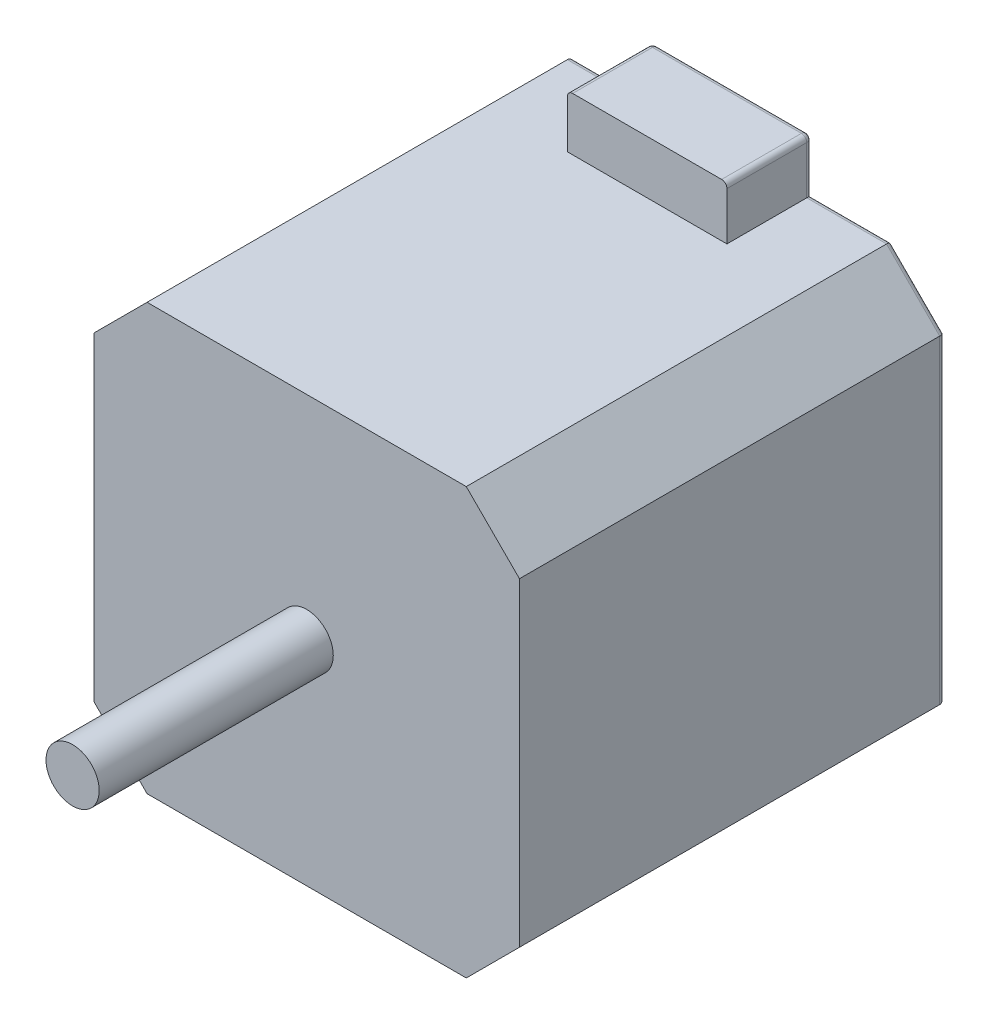
ISO-10303-21;
HEADER;
FILE_DESCRIPTION(('STEP AP214'),'2;1');
FILE_NAME('part.step','',(''),(''),'','','');
FILE_SCHEMA(('AUTOMOTIVE_DESIGN { 1 0 10303 214 1 1 1 1 }'));
ENDSEC;
DATA;
#1=APPLICATION_CONTEXT('core data for automotive mechanical design processes');
#2=APPLICATION_PROTOCOL_DEFINITION('international standard','automotive_design',2000,#1);
#3=PRODUCT_CONTEXT('',#1,'mechanical');
#4=PRODUCT('Part','Part','',(#3));
#5=PRODUCT_RELATED_PRODUCT_CATEGORY('part','',(#4));
#6=PRODUCT_DEFINITION_FORMATION('','',#4);
#7=PRODUCT_DEFINITION_CONTEXT('part definition',#1,'design');
#8=PRODUCT_DEFINITION('design','',#6,#7);
#9=PRODUCT_DEFINITION_SHAPE('','',#8);
#10=(LENGTH_UNIT() NAMED_UNIT(*) SI_UNIT(.MILLI.,.METRE.));
#11=(NAMED_UNIT(*) PLANE_ANGLE_UNIT() SI_UNIT($,.RADIAN.));
#12=(NAMED_UNIT(*) SI_UNIT($,.STERADIAN.) SOLID_ANGLE_UNIT());
#13=UNCERTAINTY_MEASURE_WITH_UNIT(LENGTH_MEASURE(1.E-05),#10,'distance_accuracy_value','');
#14=(GEOMETRIC_REPRESENTATION_CONTEXT(3) GLOBAL_UNCERTAINTY_ASSIGNED_CONTEXT((#13)) GLOBAL_UNIT_ASSIGNED_CONTEXT((#10,
#11,#12)) REPRESENTATION_CONTEXT('',''));
#15=CARTESIAN_POINT('',(0.,0.,0.));
#16=DIRECTION('',(0.,0.,1.));
#17=DIRECTION('',(1.,0.,0.));
#18=AXIS2_PLACEMENT_3D('',#15,#16,#17);
#19=CARTESIAN_POINT('',(20.,20.,40.));
#20=DIRECTION('',(0.,-1.,0.));
#21=DIRECTION('',(1.,0.,0.));
#22=AXIS2_PLACEMENT_3D('',#19,#20,#21);
#23=PLANE('',#22);
#24=DIRECTION('',(0.,0.,-1.));
#25=VECTOR('',#24,1.);
#26=CARTESIAN_POINT('',(15.,20.,40.));
#27=LINE('',#26,#25);
#28=CARTESIAN_POINT('',(15.,20.,40.));
#29=VERTEX_POINT('',#28);
#30=CARTESIAN_POINT('',(15.,20.,0.5));
#31=VERTEX_POINT('',#30);
#32=EDGE_CURVE('E245',#29,#31,#27,.T.);
#33=ORIENTED_EDGE('',*,*,#32,.T.);
#34=DIRECTION('',(-1.,0.,0.));
#35=VECTOR('',#34,1.);
#36=CARTESIAN_POINT('',(20.,20.,0.5));
#37=LINE('',#36,#35);
#38=CARTESIAN_POINT('',(7.5,20.,0.5));
#39=VERTEX_POINT('',#38);
#40=EDGE_CURVE('E285',#31,#39,#37,.T.);
#41=ORIENTED_EDGE('',*,*,#40,.T.);
#42=DIRECTION('',(0.,0.,-1.));
#43=VECTOR('',#42,1.);
#44=CARTESIAN_POINT('',(7.5,20.,8.));
#45=LINE('',#44,#43);
#46=CARTESIAN_POINT('',(7.5,20.,8.));
#47=VERTEX_POINT('',#46);
#48=EDGE_CURVE('E198',#47,#39,#45,.T.);
#49=ORIENTED_EDGE('',*,*,#48,.F.);
#50=DIRECTION('',(1.,0.,0.));
#51=VECTOR('',#50,1.);
#52=CARTESIAN_POINT('',(7.5,20.,8.));
#53=LINE('',#52,#51);
#54=CARTESIAN_POINT('',(-7.5,20.,8.));
#55=VERTEX_POINT('',#54);
#56=EDGE_CURVE('E184',#55,#47,#53,.T.);
#57=ORIENTED_EDGE('',*,*,#56,.F.);
#58=DIRECTION('',(0.,0.,-1.));
#59=VECTOR('',#58,1.);
#60=CARTESIAN_POINT('',(-7.5,20.,8.));
#61=LINE('',#60,#59);
#62=CARTESIAN_POINT('',(-7.5,20.,0.5));
#63=VERTEX_POINT('',#62);
#64=EDGE_CURVE('E191',#55,#63,#61,.T.);
#65=ORIENTED_EDGE('',*,*,#64,.T.);
#66=DIRECTION('',(-1.,0.,0.));
#67=VECTOR('',#66,1.);
#68=CARTESIAN_POINT('',(20.,20.,0.5));
#69=LINE('',#68,#67);
#70=CARTESIAN_POINT('',(-15.,20.,0.5));
#71=VERTEX_POINT('',#70);
#72=EDGE_CURVE('E283',#63,#71,#69,.T.);
#73=ORIENTED_EDGE('',*,*,#72,.T.);
#74=DIRECTION('',(0.,0.,1.));
#75=VECTOR('',#74,1.);
#76=CARTESIAN_POINT('',(-15.,20.,40.));
#77=LINE('',#76,#75);
#78=CARTESIAN_POINT('',(-15.,20.,40.));
#79=VERTEX_POINT('',#78);
#80=EDGE_CURVE('E247',#71,#79,#77,.T.);
#81=ORIENTED_EDGE('',*,*,#80,.T.);
#82=DIRECTION('',(-1.,0.,0.));
#83=VECTOR('',#82,1.);
#84=CARTESIAN_POINT('',(20.,20.,40.));
#85=LINE('',#84,#83);
#86=EDGE_CURVE('E219',#29,#79,#85,.T.);
#87=ORIENTED_EDGE('',*,*,#86,.F.);
#88=EDGE_LOOP('',(#33,#41,#49,#57,#65,#73,#81,#87));
#89=FACE_BOUND('',#88,.T.);
#90=ADVANCED_FACE('F40',(#89),#23,.F.);
#91=CARTESIAN_POINT('',(-20.,-20.,40.));
#92=DIRECTION('',(1.,0.,0.));
#93=DIRECTION('',(0.,0.,-1.));
#94=AXIS2_PLACEMENT_3D('',#91,#92,#93);
#95=PLANE('',#94);
#96=DIRECTION('',(0.,0.,-1.));
#97=VECTOR('',#96,1.);
#98=CARTESIAN_POINT('',(-20.,15.,40.));
#99=LINE('',#98,#97);
#100=CARTESIAN_POINT('',(-20.,15.,40.));
#101=VERTEX_POINT('',#100);
#102=CARTESIAN_POINT('',(-20.,15.,0.5));
#103=VERTEX_POINT('',#102);
#104=EDGE_CURVE('E227',#101,#103,#99,.T.);
#105=ORIENTED_EDGE('',*,*,#104,.T.);
#106=DIRECTION('',(0.,-1.,0.));
#107=VECTOR('',#106,1.);
#108=CARTESIAN_POINT('',(-20.,-20.,0.5));
#109=LINE('',#108,#107);
#110=CARTESIAN_POINT('',(-20.,-15.,0.5));
#111=VERTEX_POINT('',#110);
#112=EDGE_CURVE('E294',#103,#111,#109,.T.);
#113=ORIENTED_EDGE('',*,*,#112,.T.);
#114=DIRECTION('',(0.,0.,1.));
#115=VECTOR('',#114,1.);
#116=CARTESIAN_POINT('',(-20.,-15.,40.));
#117=LINE('',#116,#115);
#118=CARTESIAN_POINT('',(-20.,-15.,40.));
#119=VERTEX_POINT('',#118);
#120=EDGE_CURVE('E230',#111,#119,#117,.T.);
#121=ORIENTED_EDGE('',*,*,#120,.T.);
#122=DIRECTION('',(0.,-1.,0.));
#123=VECTOR('',#122,1.);
#124=CARTESIAN_POINT('',(-20.,-20.,40.));
#125=LINE('',#124,#123);
#126=EDGE_CURVE('E197',#101,#119,#125,.T.);
#127=ORIENTED_EDGE('',*,*,#126,.F.);
#128=EDGE_LOOP('',(#105,#113,#121,#127));
#129=FACE_BOUND('',#128,.T.);
#130=ADVANCED_FACE('F376',(#129),#95,.F.);
#131=CARTESIAN_POINT('',(20.,-20.,40.));
#132=DIRECTION('',(0.,1.,0.));
#133=DIRECTION('',(-1.,0.,0.));
#134=AXIS2_PLACEMENT_3D('',#131,#132,#133);
#135=PLANE('',#134);
#136=DIRECTION('',(0.,0.,-1.));
#137=VECTOR('',#136,1.);
#138=CARTESIAN_POINT('',(-15.,-20.,40.));
#139=LINE('',#138,#137);
#140=CARTESIAN_POINT('',(-15.,-20.,40.));
#141=VERTEX_POINT('',#140);
#142=CARTESIAN_POINT('',(-15.,-20.,0.5));
#143=VERTEX_POINT('',#142);
#144=EDGE_CURVE('E224',#141,#143,#139,.T.);
#145=ORIENTED_EDGE('',*,*,#144,.T.);
#146=DIRECTION('',(1.,0.,0.));
#147=VECTOR('',#146,1.);
#148=CARTESIAN_POINT('',(20.,-20.,0.5));
#149=LINE('',#148,#147);
#150=CARTESIAN_POINT('',(15.,-20.,0.5));
#151=VERTEX_POINT('',#150);
#152=EDGE_CURVE('E298',#143,#151,#149,.T.);
#153=ORIENTED_EDGE('',*,*,#152,.T.);
#154=DIRECTION('',(0.,0.,1.));
#155=VECTOR('',#154,1.);
#156=CARTESIAN_POINT('',(15.,-20.,40.));
#157=LINE('',#156,#155);
#158=CARTESIAN_POINT('',(15.,-20.,40.));
#159=VERTEX_POINT('',#158);
#160=EDGE_CURVE('E222',#151,#159,#157,.T.);
#161=ORIENTED_EDGE('',*,*,#160,.T.);
#162=DIRECTION('',(1.,0.,0.));
#163=VECTOR('',#162,1.);
#164=CARTESIAN_POINT('',(20.,-20.,40.));
#165=LINE('',#164,#163);
#166=EDGE_CURVE('E213',#141,#159,#165,.T.);
#167=ORIENTED_EDGE('',*,*,#166,.F.);
#168=EDGE_LOOP('',(#145,#153,#161,#167));
#169=FACE_BOUND('',#168,.T.);
#170=ADVANCED_FACE('F381',(#169),#135,.F.);
#171=CARTESIAN_POINT('',(20.,-20.,40.));
#172=DIRECTION('',(-1.,0.,0.));
#173=DIRECTION('',(0.,0.,1.));
#174=AXIS2_PLACEMENT_3D('',#171,#172,#173);
#175=PLANE('',#174);
#176=DIRECTION('',(0.,0.,-1.));
#177=VECTOR('',#176,1.);
#178=CARTESIAN_POINT('',(20.,-15.,40.));
#179=LINE('',#178,#177);
#180=CARTESIAN_POINT('',(20.,-15.,40.));
#181=VERTEX_POINT('',#180);
#182=CARTESIAN_POINT('',(20.,-15.,0.5));
#183=VERTEX_POINT('',#182);
#184=EDGE_CURVE('E242',#181,#183,#179,.T.);
#185=ORIENTED_EDGE('',*,*,#184,.T.);
#186=DIRECTION('',(0.,1.,0.));
#187=VECTOR('',#186,1.);
#188=CARTESIAN_POINT('',(20.,-20.,0.5));
#189=LINE('',#188,#187);
#190=CARTESIAN_POINT('',(20.,15.,0.5));
#191=VERTEX_POINT('',#190);
#192=EDGE_CURVE('E279',#183,#191,#189,.T.);
#193=ORIENTED_EDGE('',*,*,#192,.T.);
#194=DIRECTION('',(0.,0.,1.));
#195=VECTOR('',#194,1.);
#196=CARTESIAN_POINT('',(20.,15.,40.));
#197=LINE('',#196,#195);
#198=CARTESIAN_POINT('',(20.,15.,40.));
#199=VERTEX_POINT('',#198);
#200=EDGE_CURVE('E240',#191,#199,#197,.T.);
#201=ORIENTED_EDGE('',*,*,#200,.T.);
#202=DIRECTION('',(0.,1.,0.));
#203=VECTOR('',#202,1.);
#204=CARTESIAN_POINT('',(20.,-20.,40.));
#205=LINE('',#204,#203);
#206=EDGE_CURVE('E216',#181,#199,#205,.T.);
#207=ORIENTED_EDGE('',*,*,#206,.F.);
#208=EDGE_LOOP('',(#185,#193,#201,#207));
#209=FACE_BOUND('',#208,.T.);
#210=ADVANCED_FACE('F388',(#209),#175,.F.);
#211=CARTESIAN_POINT('',(0.,0.,40.));
#212=DIRECTION('',(0.,0.,1.));
#213=DIRECTION('',(1.,0.,0.));
#214=AXIS2_PLACEMENT_3D('',#211,#212,#213);
#215=PLANE('',#214);
#216=CARTESIAN_POINT('',(0.,0.,40.));
#217=DIRECTION('',(0.,0.,1.));
#218=DIRECTION('',(1.,0.,0.));
#219=AXIS2_PLACEMENT_3D('',#216,#217,#218);
#220=CIRCLE('',#219,2.5);
#221=CARTESIAN_POINT('',(2.5,0.,40.));
#222=VERTEX_POINT('',#221);
#223=EDGE_CURVE('E349',#222,#222,#220,.F.);
#224=ORIENTED_EDGE('',*,*,#223,.T.);
#225=EDGE_LOOP('',(#224));
#226=FACE_BOUND('',#225,.T.);
#227=ORIENTED_EDGE('',*,*,#126,.T.);
#228=DIRECTION('',(-0.707106781186547,0.707106781186549,0.));
#229=VECTOR('',#228,1.);
#230=CARTESIAN_POINT('',(-17.5,-17.5,40.));
#231=LINE('',#230,#229);
#232=EDGE_CURVE('E238',#119,#141,#231,.F.);
#233=ORIENTED_EDGE('',*,*,#232,.T.);
#234=ORIENTED_EDGE('',*,*,#166,.T.);
#235=DIRECTION('',(-0.707106781186549,-0.707106781186546,0.));
#236=VECTOR('',#235,1.);
#237=CARTESIAN_POINT('',(17.5,-17.5,40.));
#238=LINE('',#237,#236);
#239=EDGE_CURVE('E236',#159,#181,#238,.F.);
#240=ORIENTED_EDGE('',*,*,#239,.T.);
#241=ORIENTED_EDGE('',*,*,#206,.T.);
#242=DIRECTION('',(0.707106781186546,-0.707106781186549,0.));
#243=VECTOR('',#242,1.);
#244=CARTESIAN_POINT('',(17.5,17.5,40.));
#245=LINE('',#244,#243);
#246=EDGE_CURVE('E232',#199,#29,#245,.F.);
#247=ORIENTED_EDGE('',*,*,#246,.T.);
#248=ORIENTED_EDGE('',*,*,#86,.T.);
#249=DIRECTION('',(0.707106781186549,0.707106781186546,0.));
#250=VECTOR('',#249,1.);
#251=CARTESIAN_POINT('',(-17.5,17.5,40.));
#252=LINE('',#251,#250);
#253=EDGE_CURVE('E234',#79,#101,#252,.F.);
#254=ORIENTED_EDGE('',*,*,#253,.T.);
#255=EDGE_LOOP('',(#227,#233,#234,#240,#241,#247,#248,#254));
#256=FACE_BOUND('',#255,.T.);
#257=ADVANCED_FACE('F391',(#226,#256),#215,.T.);
#258=CARTESIAN_POINT('',(0.,0.,0.));
#259=DIRECTION('',(0.,0.,1.));
#260=DIRECTION('',(1.,0.,0.));
#261=AXIS2_PLACEMENT_3D('',#258,#259,#260);
#262=PLANE('',#261);
#263=DIRECTION('',(0.,1.,0.));
#264=VECTOR('',#263,1.);
#265=CARTESIAN_POINT('',(19.5,0.,0.));
#266=LINE('',#265,#264);
#267=CARTESIAN_POINT('',(19.5,14.7928932188134,0.));
#268=VERTEX_POINT('',#267);
#269=CARTESIAN_POINT('',(19.5,-14.7928932188135,0.));
#270=VERTEX_POINT('',#269);
#271=EDGE_CURVE('E271',#268,#270,#266,.F.);
#272=ORIENTED_EDGE('',*,*,#271,.T.);
#273=DIRECTION('',(0.707106781186549,0.707106781186546,0.));
#274=VECTOR('',#273,1.);
#275=CARTESIAN_POINT('',(14.6464466094067,-19.6464466094067,0.));
#276=LINE('',#275,#274);
#277=CARTESIAN_POINT('',(14.7928932188135,-19.5,0.));
#278=VERTEX_POINT('',#277);
#279=EDGE_CURVE('E273',#270,#278,#276,.F.);
#280=ORIENTED_EDGE('',*,*,#279,.T.);
#281=DIRECTION('',(1.,0.,0.));
#282=VECTOR('',#281,1.);
#283=CARTESIAN_POINT('',(0.,-19.5,0.));
#284=LINE('',#283,#282);
#285=CARTESIAN_POINT('',(-14.7928932188134,-19.5,0.));
#286=VERTEX_POINT('',#285);
#287=EDGE_CURVE('E249',#278,#286,#284,.F.);
#288=ORIENTED_EDGE('',*,*,#287,.T.);
#289=DIRECTION('',(0.707106781186547,-0.707106781186549,0.));
#290=VECTOR('',#289,1.);
#291=CARTESIAN_POINT('',(-19.6464466094067,-14.6464466094067,0.));
#292=LINE('',#291,#290);
#293=CARTESIAN_POINT('',(-19.5,-14.7928932188135,0.));
#294=VERTEX_POINT('',#293);
#295=EDGE_CURVE('E251',#286,#294,#292,.F.);
#296=ORIENTED_EDGE('',*,*,#295,.T.);
#297=DIRECTION('',(0.,-1.,0.));
#298=VECTOR('',#297,1.);
#299=CARTESIAN_POINT('',(-19.5,0.,0.));
#300=LINE('',#299,#298);
#301=CARTESIAN_POINT('',(-19.5,14.7928932188135,0.));
#302=VERTEX_POINT('',#301);
#303=EDGE_CURVE('E253',#294,#302,#300,.F.);
#304=ORIENTED_EDGE('',*,*,#303,.T.);
#305=DIRECTION('',(-0.707106781186549,-0.707106781186546,0.));
#306=VECTOR('',#305,1.);
#307=CARTESIAN_POINT('',(-14.6464466094067,19.6464466094067,0.));
#308=LINE('',#307,#306);
#309=CARTESIAN_POINT('',(-14.7928932188134,19.5,0.));
#310=VERTEX_POINT('',#309);
#311=EDGE_CURVE('E255',#302,#310,#308,.F.);
#312=ORIENTED_EDGE('',*,*,#311,.T.);
#313=DIRECTION('',(-1.,0.,0.));
#314=VECTOR('',#313,1.);
#315=CARTESIAN_POINT('',(0.,19.5,0.));
#316=LINE('',#315,#314);
#317=CARTESIAN_POINT('',(-7.,19.5,0.));
#318=VERTEX_POINT('',#317);
#319=EDGE_CURVE('E257',#310,#318,#316,.F.);
#320=ORIENTED_EDGE('',*,*,#319,.T.);
#321=DIRECTION('',(0.,-1.,0.));
#322=VECTOR('',#321,1.);
#323=CARTESIAN_POINT('',(-6.99999999999999,0.,0.));
#324=LINE('',#323,#322);
#325=CARTESIAN_POINT('',(-7.,24.5,0.));
#326=VERTEX_POINT('',#325);
#327=EDGE_CURVE('E259',#318,#326,#324,.F.);
#328=ORIENTED_EDGE('',*,*,#327,.T.);
#329=DIRECTION('',(-1.,0.,0.));
#330=VECTOR('',#329,1.);
#331=CARTESIAN_POINT('',(0.,24.5,0.));
#332=LINE('',#331,#330);
#333=CARTESIAN_POINT('',(7.,24.5,0.));
#334=VERTEX_POINT('',#333);
#335=EDGE_CURVE('E262',#326,#334,#332,.F.);
#336=ORIENTED_EDGE('',*,*,#335,.T.);
#337=DIRECTION('',(0.,1.,0.));
#338=VECTOR('',#337,1.);
#339=CARTESIAN_POINT('',(7.00000000000001,0.,0.));
#340=LINE('',#339,#338);
#341=CARTESIAN_POINT('',(7.,19.5,0.));
#342=VERTEX_POINT('',#341);
#343=EDGE_CURVE('E265',#334,#342,#340,.F.);
#344=ORIENTED_EDGE('',*,*,#343,.T.);
#345=DIRECTION('',(-1.,0.,0.));
#346=VECTOR('',#345,1.);
#347=CARTESIAN_POINT('',(0.,19.5,0.));
#348=LINE('',#347,#346);
#349=CARTESIAN_POINT('',(14.7928932188135,19.5,0.));
#350=VERTEX_POINT('',#349);
#351=EDGE_CURVE('E267',#342,#350,#348,.F.);
#352=ORIENTED_EDGE('',*,*,#351,.T.);
#353=DIRECTION('',(-0.707106781186546,0.707106781186549,0.));
#354=VECTOR('',#353,1.);
#355=CARTESIAN_POINT('',(19.6464466094067,14.6464466094067,0.));
#356=LINE('',#355,#354);
#357=EDGE_CURVE('E269',#350,#268,#356,.F.);
#358=ORIENTED_EDGE('',*,*,#357,.T.);
#359=EDGE_LOOP('',(#272,#280,#288,#296,#304,#312,#320,#328,#336,#344,#352,#358));
#360=FACE_BOUND('',#359,.T.);
#361=ADVANCED_FACE('F386',(#360),#262,.F.);
#362=CARTESIAN_POINT('',(-15.,-20.,40.));
#363=DIRECTION('',(0.707106781186548,0.707106781186546,0.));
#364=DIRECTION('',(0.,0.,-1.));
#365=AXIS2_PLACEMENT_3D('',#362,#363,#364);
#366=PLANE('',#365);
#367=ORIENTED_EDGE('',*,*,#120,.F.);
#368=DIRECTION('',(-0.707106781186547,0.707106781186549,0.));
#369=VECTOR('',#368,1.);
#370=CARTESIAN_POINT('',(-15.,-20.,0.5));
#371=LINE('',#370,#369);
#372=EDGE_CURVE('E296',#111,#143,#371,.F.);
#373=ORIENTED_EDGE('',*,*,#372,.T.);
#374=ORIENTED_EDGE('',*,*,#144,.F.);
#375=ORIENTED_EDGE('',*,*,#232,.F.);
#376=EDGE_LOOP('',(#367,#373,#374,#375));
#377=FACE_BOUND('',#376,.T.);
#378=ADVANCED_FACE('F397',(#377),#366,.F.);
#379=CARTESIAN_POINT('',(20.,-15.,40.));
#380=DIRECTION('',(-0.707106781186546,0.707106781186549,0.));
#381=DIRECTION('',(0.,0.,-1.));
#382=AXIS2_PLACEMENT_3D('',#379,#380,#381);
#383=PLANE('',#382);
#384=ORIENTED_EDGE('',*,*,#160,.F.);
#385=DIRECTION('',(-0.707106781186549,-0.707106781186546,0.));
#386=VECTOR('',#385,1.);
#387=CARTESIAN_POINT('',(20.,-15.,0.5));
#388=LINE('',#387,#386);
#389=EDGE_CURVE('E276',#151,#183,#388,.F.);
#390=ORIENTED_EDGE('',*,*,#389,.T.);
#391=ORIENTED_EDGE('',*,*,#184,.F.);
#392=ORIENTED_EDGE('',*,*,#239,.F.);
#393=EDGE_LOOP('',(#384,#390,#391,#392));
#394=FACE_BOUND('',#393,.T.);
#395=ADVANCED_FACE('F403',(#394),#383,.F.);
#396=CARTESIAN_POINT('',(-20.,15.,40.));
#397=DIRECTION('',(0.707106781186546,-0.707106781186549,0.));
#398=DIRECTION('',(0.,0.,-1.));
#399=AXIS2_PLACEMENT_3D('',#396,#397,#398);
#400=PLANE('',#399);
#401=ORIENTED_EDGE('',*,*,#80,.F.);
#402=DIRECTION('',(0.707106781186549,0.707106781186546,0.));
#403=VECTOR('',#402,1.);
#404=CARTESIAN_POINT('',(-20.,15.,0.5));
#405=LINE('',#404,#403);
#406=EDGE_CURVE('E292',#71,#103,#405,.F.);
#407=ORIENTED_EDGE('',*,*,#406,.T.);
#408=ORIENTED_EDGE('',*,*,#104,.F.);
#409=ORIENTED_EDGE('',*,*,#253,.F.);
#410=EDGE_LOOP('',(#401,#407,#408,#409));
#411=FACE_BOUND('',#410,.T.);
#412=ADVANCED_FACE('F410',(#411),#400,.F.);
#413=CARTESIAN_POINT('',(15.,20.,40.));
#414=DIRECTION('',(-0.707106781186549,-0.707106781186546,0.));
#415=DIRECTION('',(0.,0.,-1.));
#416=AXIS2_PLACEMENT_3D('',#413,#414,#415);
#417=PLANE('',#416);
#418=ORIENTED_EDGE('',*,*,#200,.F.);
#419=DIRECTION('',(0.707106781186546,-0.707106781186549,0.));
#420=VECTOR('',#419,1.);
#421=CARTESIAN_POINT('',(15.,20.,0.5));
#422=LINE('',#421,#420);
#423=EDGE_CURVE('E281',#191,#31,#422,.F.);
#424=ORIENTED_EDGE('',*,*,#423,.T.);
#425=ORIENTED_EDGE('',*,*,#32,.F.);
#426=ORIENTED_EDGE('',*,*,#246,.F.);
#427=EDGE_LOOP('',(#418,#424,#425,#426));
#428=FACE_BOUND('',#427,.T.);
#429=ADVANCED_FACE('F417',(#428),#417,.F.);
#430=CARTESIAN_POINT('',(-7.5,25.,8.));
#431=DIRECTION('',(1.,0.,0.));
#432=DIRECTION('',(0.,1.,0.));
#433=AXIS2_PLACEMENT_3D('',#430,#431,#432);
#434=PLANE('',#433);
#435=DIRECTION('',(0.,-1.,0.));
#436=VECTOR('',#435,1.);
#437=CARTESIAN_POINT('',(-7.5,25.,8.));
#438=LINE('',#437,#436);
#439=CARTESIAN_POINT('',(-7.5,24.5,8.));
#440=VERTEX_POINT('',#439);
#441=EDGE_CURVE('E180',#440,#55,#438,.T.);
#442=ORIENTED_EDGE('',*,*,#441,.F.);
#443=DIRECTION('',(0.,0.,-1.));
#444=VECTOR('',#443,1.);
#445=CARTESIAN_POINT('',(-7.5,24.5,8.));
#446=LINE('',#445,#444);
#447=CARTESIAN_POINT('',(-7.5,24.5,0.5));
#448=VERTEX_POINT('',#447);
#449=EDGE_CURVE('E338',#440,#448,#446,.T.);
#450=ORIENTED_EDGE('',*,*,#449,.T.);
#451=DIRECTION('',(0.,-1.,0.));
#452=VECTOR('',#451,1.);
#453=CARTESIAN_POINT('',(-7.5,25.,0.5));
#454=LINE('',#453,#452);
#455=EDGE_CURVE('E194',#448,#63,#454,.T.);
#456=ORIENTED_EDGE('',*,*,#455,.T.);
#457=ORIENTED_EDGE('',*,*,#64,.F.);
#458=EDGE_LOOP('',(#442,#450,#456,#457));
#459=FACE_BOUND('',#458,.T.);
#460=ADVANCED_FACE('F192',(#459),#434,.F.);
#461=CARTESIAN_POINT('',(7.5,25.,8.));
#462=DIRECTION('',(-1.,0.,0.));
#463=DIRECTION('',(0.,-1.,0.));
#464=AXIS2_PLACEMENT_3D('',#461,#462,#463);
#465=PLANE('',#464);
#466=DIRECTION('',(0.,1.,0.));
#467=VECTOR('',#466,1.);
#468=CARTESIAN_POINT('',(7.5,25.,0.5));
#469=LINE('',#468,#467);
#470=CARTESIAN_POINT('',(7.5,24.5,0.5));
#471=VERTEX_POINT('',#470);
#472=EDGE_CURVE('E287',#39,#471,#469,.T.);
#473=ORIENTED_EDGE('',*,*,#472,.T.);
#474=DIRECTION('',(0.,0.,-1.));
#475=VECTOR('',#474,1.);
#476=CARTESIAN_POINT('',(7.5,24.5,8.));
#477=LINE('',#476,#475);
#478=CARTESIAN_POINT('',(7.5,24.5,8.));
#479=VERTEX_POINT('',#478);
#480=EDGE_CURVE('E11',#471,#479,#477,.F.);
#481=ORIENTED_EDGE('',*,*,#480,.T.);
#482=DIRECTION('',(0.,1.,0.));
#483=VECTOR('',#482,1.);
#484=CARTESIAN_POINT('',(7.5,25.,8.));
#485=LINE('',#484,#483);
#486=EDGE_CURVE('E203',#47,#479,#485,.T.);
#487=ORIENTED_EDGE('',*,*,#486,.F.);
#488=ORIENTED_EDGE('',*,*,#48,.T.);
#489=EDGE_LOOP('',(#473,#481,#487,#488));
#490=FACE_BOUND('',#489,.T.);
#491=ADVANCED_FACE('F491',(#490),#465,.F.);
#492=CARTESIAN_POINT('',(7.5,25.,8.));
#493=DIRECTION('',(0.,-1.,0.));
#494=DIRECTION('',(1.,0.,0.));
#495=AXIS2_PLACEMENT_3D('',#492,#493,#494);
#496=PLANE('',#495);
#497=DIRECTION('',(-1.,0.,0.));
#498=VECTOR('',#497,1.);
#499=CARTESIAN_POINT('',(7.5,25.,0.5));
#500=LINE('',#499,#498);
#501=CARTESIAN_POINT('',(7.,25.,0.5));
#502=VERTEX_POINT('',#501);
#503=CARTESIAN_POINT('',(-7.,25.,0.5));
#504=VERTEX_POINT('',#503);
#505=EDGE_CURVE('E289',#502,#504,#500,.T.);
#506=ORIENTED_EDGE('',*,*,#505,.T.);
#507=DIRECTION('',(0.,0.,-1.));
#508=VECTOR('',#507,1.);
#509=CARTESIAN_POINT('',(-7.,25.,8.));
#510=LINE('',#509,#508);
#511=CARTESIAN_POINT('',(-7.,25.,8.));
#512=VERTEX_POINT('',#511);
#513=EDGE_CURVE('E63',#504,#512,#510,.F.);
#514=ORIENTED_EDGE('',*,*,#513,.T.);
#515=DIRECTION('',(-1.,0.,0.));
#516=VECTOR('',#515,1.);
#517=CARTESIAN_POINT('',(7.5,25.,8.));
#518=LINE('',#517,#516);
#519=CARTESIAN_POINT('',(7.,25.,8.));
#520=VERTEX_POINT('',#519);
#521=EDGE_CURVE('E205',#520,#512,#518,.T.);
#522=ORIENTED_EDGE('',*,*,#521,.F.);
#523=DIRECTION('',(0.,0.,-1.));
#524=VECTOR('',#523,1.);
#525=CARTESIAN_POINT('',(7.,25.,8.));
#526=LINE('',#525,#524);
#527=EDGE_CURVE('E340',#520,#502,#526,.T.);
#528=ORIENTED_EDGE('',*,*,#527,.T.);
#529=EDGE_LOOP('',(#506,#514,#522,#528));
#530=FACE_BOUND('',#529,.T.);
#531=ADVANCED_FACE('F484',(#530),#496,.F.);
#532=CARTESIAN_POINT('',(0.,0.,8.));
#533=DIRECTION('',(0.,0.,-1.));
#534=DIRECTION('',(-1.,0.,0.));
#535=AXIS2_PLACEMENT_3D('',#532,#533,#534);
#536=PLANE('',#535);
#537=ORIENTED_EDGE('',*,*,#521,.T.);
#538=CARTESIAN_POINT('',(-7.,24.5,8.));
#539=DIRECTION('',(0.,0.,-1.));
#540=DIRECTION('',(-1.,0.,0.));
#541=AXIS2_PLACEMENT_3D('',#538,#539,#540);
#542=CIRCLE('',#541,0.5);
#543=EDGE_CURVE('E49',#512,#440,#542,.F.);
#544=ORIENTED_EDGE('',*,*,#543,.T.);
#545=ORIENTED_EDGE('',*,*,#441,.T.);
#546=ORIENTED_EDGE('',*,*,#56,.T.);
#547=ORIENTED_EDGE('',*,*,#486,.T.);
#548=CARTESIAN_POINT('',(7.,24.5,8.));
#549=DIRECTION('',(0.,0.,-1.));
#550=DIRECTION('',(-1.,0.,0.));
#551=AXIS2_PLACEMENT_3D('',#548,#549,#550);
#552=CIRCLE('',#551,0.5);
#553=EDGE_CURVE('E343',#479,#520,#552,.F.);
#554=ORIENTED_EDGE('',*,*,#553,.T.);
#555=EDGE_LOOP('',(#537,#544,#545,#546,#547,#554));
#556=FACE_BOUND('',#555,.T.);
#557=ADVANCED_FACE('F182',(#556),#536,.F.);
#558=CARTESIAN_POINT('',(-7.,25.,0.5));
#559=DIRECTION('',(0.,-1.,0.));
#560=DIRECTION('',(1.,0.,0.));
#561=AXIS2_PLACEMENT_3D('',#558,#559,#560);
#562=CYLINDRICAL_SURFACE('',#561,0.5);
#563=ORIENTED_EDGE('',*,*,#455,.F.);
#564=CARTESIAN_POINT('',(-7.,24.5,0.5));
#565=DIRECTION('',(0.,-1.,0.));
#566=DIRECTION('',(1.,0.,0.));
#567=AXIS2_PLACEMENT_3D('',#564,#565,#566);
#568=CIRCLE('',#567,0.5);
#569=EDGE_CURVE('E333',#448,#326,#568,.T.);
#570=ORIENTED_EDGE('',*,*,#569,.T.);
#571=ORIENTED_EDGE('',*,*,#327,.F.);
#572=CARTESIAN_POINT('',(-7.,19.5,0.5));
#573=DIRECTION('',(-0.707106781186547,-0.707106781186548,0.));
#574=DIRECTION('',(0.707106781186548,-0.707106781186547,0.));
#575=AXIS2_PLACEMENT_3D('',#572,#573,#574);
#576=ELLIPSE('',#575,0.707106781186548,0.5);
#577=EDGE_CURVE('E188',#63,#318,#576,.T.);
#578=ORIENTED_EDGE('',*,*,#577,.F.);
#579=EDGE_LOOP('',(#563,#570,#571,#578));
#580=FACE_BOUND('',#579,.T.);
#581=ADVANCED_FACE('F468',(#580),#562,.T.);
#582=CARTESIAN_POINT('',(7.5,24.5,0.5));
#583=DIRECTION('',(-1.,0.,0.));
#584=DIRECTION('',(0.,-1.,0.));
#585=AXIS2_PLACEMENT_3D('',#582,#583,#584);
#586=CYLINDRICAL_SURFACE('',#585,0.5);
#587=ORIENTED_EDGE('',*,*,#335,.F.);
#588=CARTESIAN_POINT('',(-7.,24.5,0.5));
#589=DIRECTION('',(-1.,0.,0.));
#590=DIRECTION('',(0.,-1.,0.));
#591=AXIS2_PLACEMENT_3D('',#588,#589,#590);
#592=CIRCLE('',#591,0.5);
#593=EDGE_CURVE('E330',#326,#504,#592,.F.);
#594=ORIENTED_EDGE('',*,*,#593,.T.);
#595=ORIENTED_EDGE('',*,*,#505,.F.);
#596=CARTESIAN_POINT('',(7.,24.5,0.5));
#597=DIRECTION('',(-1.,0.,0.));
#598=DIRECTION('',(0.,-1.,0.));
#599=AXIS2_PLACEMENT_3D('',#596,#597,#598);
#600=CIRCLE('',#599,0.5);
#601=EDGE_CURVE('E300',#502,#334,#600,.T.);
#602=ORIENTED_EDGE('',*,*,#601,.T.);
#603=EDGE_LOOP('',(#587,#594,#595,#602));
#604=FACE_BOUND('',#603,.T.);
#605=ADVANCED_FACE('F464',(#604),#586,.T.);
#606=CARTESIAN_POINT('',(20.,19.5,0.5));
#607=DIRECTION('',(-1.,0.,0.));
#608=DIRECTION('',(0.,-1.,0.));
#609=AXIS2_PLACEMENT_3D('',#606,#607,#608);
#610=CYLINDRICAL_SURFACE('',#609,0.5);
#611=ORIENTED_EDGE('',*,*,#577,.T.);
#612=ORIENTED_EDGE('',*,*,#319,.F.);
#613=CARTESIAN_POINT('',(-14.7928932188135,19.5,0.5));
#614=DIRECTION('',(0.923879532511287,0.382683432365089,0.));
#615=DIRECTION('',(-0.382683432365089,0.923879532511287,0.));
#616=AXIS2_PLACEMENT_3D('',#613,#614,#615);
#617=ELLIPSE('',#616,0.541196100146197,0.5);
#618=EDGE_CURVE('E324',#71,#310,#617,.F.);
#619=ORIENTED_EDGE('',*,*,#618,.F.);
#620=ORIENTED_EDGE('',*,*,#72,.F.);
#621=EDGE_LOOP('',(#611,#612,#619,#620));
#622=FACE_BOUND('',#621,.T.);
#623=ADVANCED_FACE('F460',(#622),#610,.T.);
#624=CARTESIAN_POINT('',(7.,25.,0.5));
#625=DIRECTION('',(0.,1.,0.));
#626=DIRECTION('',(-1.,0.,0.));
#627=AXIS2_PLACEMENT_3D('',#624,#625,#626);
#628=CYLINDRICAL_SURFACE('',#627,0.5);
#629=ORIENTED_EDGE('',*,*,#343,.F.);
#630=CARTESIAN_POINT('',(7.,24.5,0.5));
#631=DIRECTION('',(0.,1.,0.));
#632=DIRECTION('',(-1.,0.,0.));
#633=AXIS2_PLACEMENT_3D('',#630,#631,#632);
#634=CIRCLE('',#633,0.5);
#635=EDGE_CURVE('E335',#334,#471,#634,.F.);
#636=ORIENTED_EDGE('',*,*,#635,.T.);
#637=ORIENTED_EDGE('',*,*,#472,.F.);
#638=CARTESIAN_POINT('',(7.,19.5,0.5));
#639=DIRECTION('',(-0.707106781186548,0.707106781186547,0.));
#640=DIRECTION('',(-0.707106781186547,-0.707106781186548,0.));
#641=AXIS2_PLACEMENT_3D('',#638,#639,#640);
#642=ELLIPSE('',#641,0.707106781186547,0.5);
#643=EDGE_CURVE('E321',#342,#39,#642,.F.);
#644=ORIENTED_EDGE('',*,*,#643,.F.);
#645=EDGE_LOOP('',(#629,#636,#637,#644));
#646=FACE_BOUND('',#645,.T.);
#647=ADVANCED_FACE('F456',(#646),#628,.T.);
#648=CARTESIAN_POINT('',(-17.1464466094067,17.1464466094068,0.5));
#649=DIRECTION('',(0.707106781186549,0.707106781186546,0.));
#650=DIRECTION('',(-0.707106781186546,0.707106781186549,0.));
#651=AXIS2_PLACEMENT_3D('',#648,#649,#650);
#652=CYLINDRICAL_SURFACE('',#651,0.5);
#653=ORIENTED_EDGE('',*,*,#618,.T.);
#654=ORIENTED_EDGE('',*,*,#311,.F.);
#655=CARTESIAN_POINT('',(-19.5,14.7928932188135,0.5));
#656=DIRECTION('',(-0.382683432365091,-0.923879532511286,0.));
#657=DIRECTION('',(0.923879532511286,-0.382683432365091,0.));
#658=AXIS2_PLACEMENT_3D('',#655,#656,#657);
#659=ELLIPSE('',#658,0.541196100146197,0.5);
#660=EDGE_CURVE('E318',#103,#302,#659,.T.);
#661=ORIENTED_EDGE('',*,*,#660,.F.);
#662=ORIENTED_EDGE('',*,*,#406,.F.);
#663=EDGE_LOOP('',(#653,#654,#661,#662));
#664=FACE_BOUND('',#663,.T.);
#665=ADVANCED_FACE('F452',(#664),#652,.T.);
#666=CARTESIAN_POINT('',(20.,19.5,0.5));
#667=DIRECTION('',(-1.,0.,0.));
#668=DIRECTION('',(0.,-1.,0.));
#669=AXIS2_PLACEMENT_3D('',#666,#667,#668);
#670=CYLINDRICAL_SURFACE('',#669,0.5);
#671=ORIENTED_EDGE('',*,*,#643,.T.);
#672=ORIENTED_EDGE('',*,*,#40,.F.);
#673=CARTESIAN_POINT('',(14.7928932188135,19.5,0.5));
#674=DIRECTION('',(-0.923879532511286,0.382683432365091,0.));
#675=DIRECTION('',(-0.382683432365091,-0.923879532511286,0.));
#676=AXIS2_PLACEMENT_3D('',#673,#674,#675);
#677=ELLIPSE('',#676,0.541196100146197,0.5);
#678=EDGE_CURVE('E315',#350,#31,#677,.F.);
#679=ORIENTED_EDGE('',*,*,#678,.F.);
#680=ORIENTED_EDGE('',*,*,#351,.F.);
#681=EDGE_LOOP('',(#671,#672,#679,#680));
#682=FACE_BOUND('',#681,.T.);
#683=ADVANCED_FACE('F448',(#682),#670,.T.);
#684=CARTESIAN_POINT('',(-19.5,-20.,0.5));
#685=DIRECTION('',(0.,-1.,0.));
#686=DIRECTION('',(0.,0.,-1.));
#687=AXIS2_PLACEMENT_3D('',#684,#685,#686);
#688=CYLINDRICAL_SURFACE('',#687,0.5);
#689=ORIENTED_EDGE('',*,*,#660,.T.);
#690=ORIENTED_EDGE('',*,*,#303,.F.);
#691=CARTESIAN_POINT('',(-19.5,-14.7928932188135,0.5));
#692=DIRECTION('',(-0.382683432365089,0.923879532511287,0.));
#693=DIRECTION('',(-0.923879532511287,-0.382683432365089,0.));
#694=AXIS2_PLACEMENT_3D('',#691,#692,#693);
#695=ELLIPSE('',#694,0.541196100146197,0.5);
#696=EDGE_CURVE('E312',#111,#294,#695,.F.);
#697=ORIENTED_EDGE('',*,*,#696,.F.);
#698=ORIENTED_EDGE('',*,*,#112,.F.);
#699=EDGE_LOOP('',(#689,#690,#697,#698));
#700=FACE_BOUND('',#699,.T.);
#701=ADVANCED_FACE('F444',(#700),#688,.T.);
#702=CARTESIAN_POINT('',(17.1464466094068,17.1464466094067,0.5));
#703=DIRECTION('',(0.707106781186546,-0.707106781186549,0.));
#704=DIRECTION('',(0.707106781186549,0.707106781186546,0.));
#705=AXIS2_PLACEMENT_3D('',#702,#703,#704);
#706=CYLINDRICAL_SURFACE('',#705,0.5);
#707=ORIENTED_EDGE('',*,*,#678,.T.);
#708=ORIENTED_EDGE('',*,*,#423,.F.);
#709=CARTESIAN_POINT('',(19.5,14.7928932188135,0.5));
#710=DIRECTION('',(0.382683432365089,-0.923879532511287,0.));
#711=DIRECTION('',(0.923879532511287,0.382683432365089,0.));
#712=AXIS2_PLACEMENT_3D('',#709,#710,#711);
#713=ELLIPSE('',#712,0.541196100146197,0.5);
#714=EDGE_CURVE('E309',#268,#191,#713,.T.);
#715=ORIENTED_EDGE('',*,*,#714,.F.);
#716=ORIENTED_EDGE('',*,*,#357,.F.);
#717=EDGE_LOOP('',(#707,#708,#715,#716));
#718=FACE_BOUND('',#717,.T.);
#719=ADVANCED_FACE('F440',(#718),#706,.T.);
#720=CARTESIAN_POINT('',(-17.1464466094067,-17.1464466094067,0.5));
#721=DIRECTION('',(-0.707106781186547,0.707106781186549,0.));
#722=DIRECTION('',(-0.707106781186549,-0.707106781186547,0.));
#723=AXIS2_PLACEMENT_3D('',#720,#721,#722);
#724=CYLINDRICAL_SURFACE('',#723,0.5);
#725=ORIENTED_EDGE('',*,*,#696,.T.);
#726=ORIENTED_EDGE('',*,*,#295,.F.);
#727=CARTESIAN_POINT('',(-14.7928932188134,-19.5,0.5));
#728=DIRECTION('',(0.923879532511287,-0.38268343236509,0.));
#729=DIRECTION('',(0.38268343236509,0.923879532511287,0.));
#730=AXIS2_PLACEMENT_3D('',#727,#728,#729);
#731=ELLIPSE('',#730,0.541196100146197,0.5);
#732=EDGE_CURVE('E306',#143,#286,#731,.T.);
#733=ORIENTED_EDGE('',*,*,#732,.F.);
#734=ORIENTED_EDGE('',*,*,#372,.F.);
#735=EDGE_LOOP('',(#725,#726,#733,#734));
#736=FACE_BOUND('',#735,.T.);
#737=ADVANCED_FACE('F436',(#736),#724,.T.);
#738=CARTESIAN_POINT('',(19.5,-20.,0.5));
#739=DIRECTION('',(0.,1.,0.));
#740=DIRECTION('',(0.,0.,1.));
#741=AXIS2_PLACEMENT_3D('',#738,#739,#740);
#742=CYLINDRICAL_SURFACE('',#741,0.5);
#743=ORIENTED_EDGE('',*,*,#714,.T.);
#744=ORIENTED_EDGE('',*,*,#192,.F.);
#745=CARTESIAN_POINT('',(19.5,-14.7928932188135,0.5));
#746=DIRECTION('',(0.382683432365091,0.923879532511286,0.));
#747=DIRECTION('',(-0.923879532511286,0.382683432365091,0.));
#748=AXIS2_PLACEMENT_3D('',#745,#746,#747);
#749=ELLIPSE('',#748,0.541196100146197,0.5);
#750=EDGE_CURVE('E303',#270,#183,#749,.F.);
#751=ORIENTED_EDGE('',*,*,#750,.F.);
#752=ORIENTED_EDGE('',*,*,#271,.F.);
#753=EDGE_LOOP('',(#743,#744,#751,#752));
#754=FACE_BOUND('',#753,.T.);
#755=ADVANCED_FACE('F432',(#754),#742,.T.);
#756=CARTESIAN_POINT('',(20.,-19.5,0.5));
#757=DIRECTION('',(1.,0.,0.));
#758=DIRECTION('',(0.,1.,0.));
#759=AXIS2_PLACEMENT_3D('',#756,#757,#758);
#760=CYLINDRICAL_SURFACE('',#759,0.5);
#761=ORIENTED_EDGE('',*,*,#732,.T.);
#762=ORIENTED_EDGE('',*,*,#287,.F.);
#763=CARTESIAN_POINT('',(14.7928932188135,-19.5,0.5));
#764=DIRECTION('',(0.923879532511287,0.382683432365089,0.));
#765=DIRECTION('',(0.382683432365089,-0.923879532511287,0.));
#766=AXIS2_PLACEMENT_3D('',#763,#764,#765);
#767=ELLIPSE('',#766,0.541196100146197,0.5);
#768=EDGE_CURVE('E301',#151,#278,#767,.T.);
#769=ORIENTED_EDGE('',*,*,#768,.F.);
#770=ORIENTED_EDGE('',*,*,#152,.F.);
#771=EDGE_LOOP('',(#761,#762,#769,#770));
#772=FACE_BOUND('',#771,.T.);
#773=ADVANCED_FACE('F428',(#772),#760,.T.);
#774=CARTESIAN_POINT('',(17.1464466094067,-17.1464466094068,0.5));
#775=DIRECTION('',(-0.707106781186549,-0.707106781186546,0.));
#776=DIRECTION('',(0.707106781186546,-0.707106781186549,0.));
#777=AXIS2_PLACEMENT_3D('',#774,#775,#776);
#778=CYLINDRICAL_SURFACE('',#777,0.5);
#779=ORIENTED_EDGE('',*,*,#750,.T.);
#780=ORIENTED_EDGE('',*,*,#389,.F.);
#781=ORIENTED_EDGE('',*,*,#768,.T.);
#782=ORIENTED_EDGE('',*,*,#279,.F.);
#783=EDGE_LOOP('',(#779,#780,#781,#782));
#784=FACE_BOUND('',#783,.T.);
#785=ADVANCED_FACE('F424',(#784),#778,.T.);
#786=CARTESIAN_POINT('',(-7.,24.5,8.));
#787=DIRECTION('',(0.,0.,-1.));
#788=DIRECTION('',(-1.,0.,0.));
#789=AXIS2_PLACEMENT_3D('',#786,#787,#788);
#790=CYLINDRICAL_SURFACE('',#789,0.5);
#791=ORIENTED_EDGE('',*,*,#543,.F.);
#792=ORIENTED_EDGE('',*,*,#513,.F.);
#793=CARTESIAN_POINT('',(-7.,24.5,0.5));
#794=DIRECTION('',(0.,0.,-1.));
#795=DIRECTION('',(-1.,0.,0.));
#796=AXIS2_PLACEMENT_3D('',#793,#794,#795);
#797=CIRCLE('',#796,0.5);
#798=EDGE_CURVE('E304',#448,#504,#797,.T.);
#799=ORIENTED_EDGE('',*,*,#798,.F.);
#800=ORIENTED_EDGE('',*,*,#449,.F.);
#801=EDGE_LOOP('',(#791,#792,#799,#800));
#802=FACE_BOUND('',#801,.T.);
#803=ADVANCED_FACE('F427',(#802),#790,.T.);
#804=CARTESIAN_POINT('',(-7.,24.5,0.5));
#805=DIRECTION('',(0.,0.,1.));
#806=DIRECTION('',(1.,0.,0.));
#807=AXIS2_PLACEMENT_3D('',#804,#805,#806);
#808=SPHERICAL_SURFACE('',#807,0.5);
#809=ORIENTED_EDGE('',*,*,#593,.F.);
#810=ORIENTED_EDGE('',*,*,#569,.F.);
#811=ORIENTED_EDGE('',*,*,#798,.T.);
#812=EDGE_LOOP('',(#809,#810,#811));
#813=FACE_BOUND('',#812,.T.);
#814=ADVANCED_FACE('F473',(#813),#808,.T.);
#815=CARTESIAN_POINT('',(7.,24.5,8.));
#816=DIRECTION('',(0.,0.,-1.));
#817=DIRECTION('',(-1.,0.,0.));
#818=AXIS2_PLACEMENT_3D('',#815,#816,#817);
#819=CYLINDRICAL_SURFACE('',#818,0.5);
#820=ORIENTED_EDGE('',*,*,#553,.F.);
#821=ORIENTED_EDGE('',*,*,#480,.F.);
#822=CARTESIAN_POINT('',(7.,24.5,0.5));
#823=DIRECTION('',(0.,0.,-1.));
#824=DIRECTION('',(-1.,0.,0.));
#825=AXIS2_PLACEMENT_3D('',#822,#823,#824);
#826=CIRCLE('',#825,0.5);
#827=EDGE_CURVE('E44',#502,#471,#826,.T.);
#828=ORIENTED_EDGE('',*,*,#827,.F.);
#829=ORIENTED_EDGE('',*,*,#527,.F.);
#830=EDGE_LOOP('',(#820,#821,#828,#829));
#831=FACE_BOUND('',#830,.T.);
#832=ADVANCED_FACE('F42',(#831),#819,.T.);
#833=CARTESIAN_POINT('',(7.,24.5,0.5));
#834=DIRECTION('',(0.,0.,1.));
#835=DIRECTION('',(1.,0.,0.));
#836=AXIS2_PLACEMENT_3D('',#833,#834,#835);
#837=SPHERICAL_SURFACE('',#836,0.5);
#838=ORIENTED_EDGE('',*,*,#635,.F.);
#839=ORIENTED_EDGE('',*,*,#601,.F.);
#840=ORIENTED_EDGE('',*,*,#827,.T.);
#841=EDGE_LOOP('',(#838,#839,#840));
#842=FACE_BOUND('',#841,.T.);
#843=ADVANCED_FACE('F366',(#842),#837,.T.);
#844=CARTESIAN_POINT('',(0.,0.,62.));
#845=DIRECTION('',(0.,0.,-1.));
#846=DIRECTION('',(-1.,0.,0.));
#847=AXIS2_PLACEMENT_3D('',#844,#845,#846);
#848=CYLINDRICAL_SURFACE('',#847,2.5);
#849=ORIENTED_EDGE('',*,*,#223,.F.);
#850=EDGE_LOOP('',(#849));
#851=FACE_BOUND('',#850,.T.);
#852=CARTESIAN_POINT('',(0.,0.,62.));
#853=DIRECTION('',(0.,0.,1.));
#854=DIRECTION('',(1.,0.,0.));
#855=AXIS2_PLACEMENT_3D('',#852,#853,#854);
#856=CIRCLE('',#855,2.5);
#857=CARTESIAN_POINT('',(2.5,0.,62.));
#858=VERTEX_POINT('',#857);
#859=EDGE_CURVE('E355',#858,#858,#856,.T.);
#860=ORIENTED_EDGE('',*,*,#859,.F.);
#861=EDGE_LOOP('',(#860));
#862=FACE_BOUND('',#861,.T.);
#863=ADVANCED_FACE('F364',(#851,#862),#848,.T.);
#864=CARTESIAN_POINT('',(0.,0.,62.));
#865=DIRECTION('',(0.,0.,1.));
#866=DIRECTION('',(1.,0.,0.));
#867=AXIS2_PLACEMENT_3D('',#864,#865,#866);
#868=PLANE('',#867);
#869=ORIENTED_EDGE('',*,*,#859,.T.);
#870=EDGE_LOOP('',(#869));
#871=FACE_BOUND('',#870,.T.);
#872=ADVANCED_FACE('F362',(#871),#868,.T.);
#873=CLOSED_SHELL('',(#90,#130,#170,#210,#257,#361,#378,#395,#412,#429,#460,#491,#531,#557,#581,
#605,#623,#647,#665,#683,#701,#719,#737,#755,#773,#785,#803,#814,#832,#843,#863,#872));
#874=MANIFOLD_SOLID_BREP('B2',#873);
#875=ADVANCED_BREP_SHAPE_REPRESENTATION('',(#18,#874),#14);
#876=SHAPE_DEFINITION_REPRESENTATION(#9,#875);
ENDSEC;
END-ISO-10303-21;
